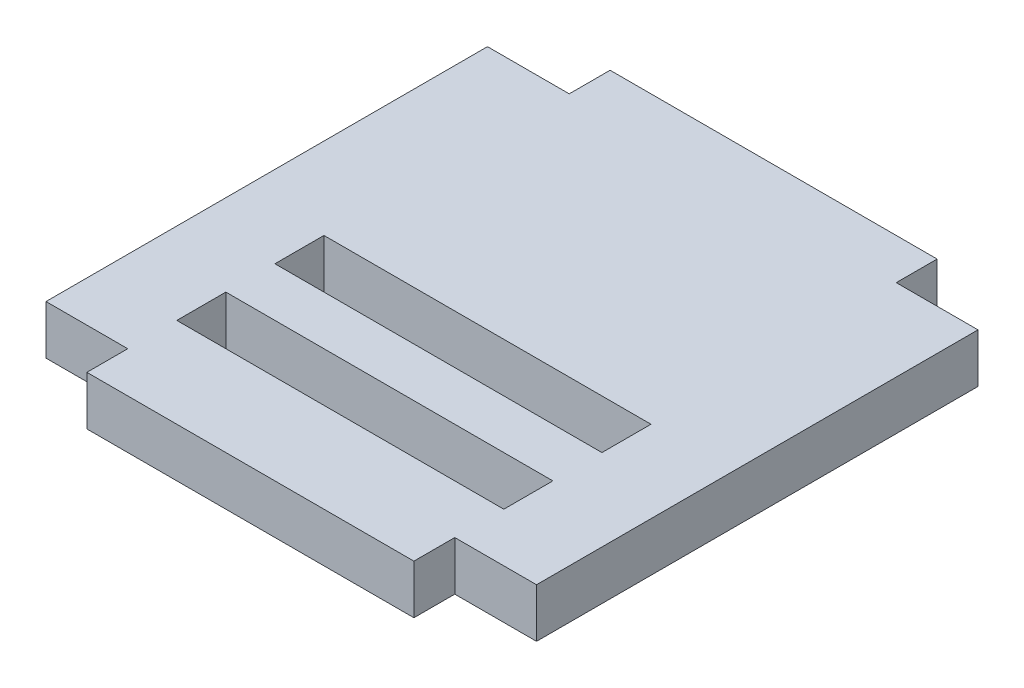
ISO-10303-21;
HEADER;
FILE_DESCRIPTION(('STEP AP214'),'2;1');
FILE_NAME('part.step','',(''),(''),'','','');
FILE_SCHEMA(('AUTOMOTIVE_DESIGN { 1 0 10303 214 1 1 1 1 }'));
ENDSEC;
DATA;
#1=APPLICATION_CONTEXT('core data for automotive mechanical design processes');
#2=APPLICATION_PROTOCOL_DEFINITION('international standard','automotive_design',2000,#1);
#3=PRODUCT_CONTEXT('',#1,'mechanical');
#4=PRODUCT('Part','Part','',(#3));
#5=PRODUCT_RELATED_PRODUCT_CATEGORY('part','',(#4));
#6=PRODUCT_DEFINITION_FORMATION('','',#4);
#7=PRODUCT_DEFINITION_CONTEXT('part definition',#1,'design');
#8=PRODUCT_DEFINITION('design','',#6,#7);
#9=PRODUCT_DEFINITION_SHAPE('','',#8);
#10=(LENGTH_UNIT() NAMED_UNIT(*) SI_UNIT(.MILLI.,.METRE.));
#11=(NAMED_UNIT(*) PLANE_ANGLE_UNIT() SI_UNIT($,.RADIAN.));
#12=(NAMED_UNIT(*) SI_UNIT($,.STERADIAN.) SOLID_ANGLE_UNIT());
#13=UNCERTAINTY_MEASURE_WITH_UNIT(LENGTH_MEASURE(1.E-05),#10,'distance_accuracy_value','');
#14=(GEOMETRIC_REPRESENTATION_CONTEXT(3) GLOBAL_UNCERTAINTY_ASSIGNED_CONTEXT((#13)) GLOBAL_UNIT_ASSIGNED_CONTEXT((#10,
#11,#12)) REPRESENTATION_CONTEXT('',''));
#15=CARTESIAN_POINT('',(0.,0.,0.));
#16=DIRECTION('',(0.,0.,1.));
#17=DIRECTION('',(1.,0.,0.));
#18=AXIS2_PLACEMENT_3D('',#15,#16,#17);
#19=CARTESIAN_POINT('',(-10.,3.,0.));
#20=DIRECTION('',(-1.,0.,0.));
#21=DIRECTION('',(0.,0.,1.));
#22=AXIS2_PLACEMENT_3D('',#19,#20,#21);
#23=PLANE('',#22);
#24=DIRECTION('',(0.,0.,-1.));
#25=VECTOR('',#24,1.);
#26=CARTESIAN_POINT('',(-10.,0.,0.));
#27=LINE('',#26,#25);
#28=CARTESIAN_POINT('',(-10.,0.,-13.5));
#29=VERTEX_POINT('',#28);
#30=CARTESIAN_POINT('',(-10.,0.,-16.));
#31=VERTEX_POINT('',#30);
#32=EDGE_CURVE('E209',#29,#31,#27,.T.);
#33=ORIENTED_EDGE('',*,*,#32,.F.);
#34=DIRECTION('',(0.,-1.,0.));
#35=VECTOR('',#34,1.);
#36=CARTESIAN_POINT('',(-10.,3.,-13.5));
#37=LINE('',#36,#35);
#38=CARTESIAN_POINT('',(-10.,3.,-13.5));
#39=VERTEX_POINT('',#38);
#40=EDGE_CURVE('E11',#39,#29,#37,.T.);
#41=ORIENTED_EDGE('',*,*,#40,.F.);
#42=DIRECTION('',(0.,0.,-1.));
#43=VECTOR('',#42,1.);
#44=CARTESIAN_POINT('',(-10.,3.,0.));
#45=LINE('',#44,#43);
#46=CARTESIAN_POINT('',(-10.,3.,-16.));
#47=VERTEX_POINT('',#46);
#48=EDGE_CURVE('E242',#39,#47,#45,.T.);
#49=ORIENTED_EDGE('',*,*,#48,.T.);
#50=DIRECTION('',(0.,-1.,0.));
#51=VECTOR('',#50,1.);
#52=CARTESIAN_POINT('',(-10.,3.,-16.));
#53=LINE('',#52,#51);
#54=EDGE_CURVE('E270',#47,#31,#53,.T.);
#55=ORIENTED_EDGE('',*,*,#54,.T.);
#56=EDGE_LOOP('',(#33,#41,#49,#55));
#57=FACE_BOUND('',#56,.T.);
#58=ADVANCED_FACE('F37',(#57),#23,.T.);
#59=CARTESIAN_POINT('',(0.,3.,-13.5));
#60=DIRECTION('',(0.,0.,-1.));
#61=DIRECTION('',(-1.,0.,0.));
#62=AXIS2_PLACEMENT_3D('',#59,#60,#61);
#63=PLANE('',#62);
#64=DIRECTION('',(1.,0.,0.));
#65=VECTOR('',#64,1.);
#66=CARTESIAN_POINT('',(0.,0.,-13.5));
#67=LINE('',#66,#65);
#68=CARTESIAN_POINT('',(-15.,0.,-13.5));
#69=VERTEX_POINT('',#68);
#70=EDGE_CURVE('E273',#69,#29,#67,.T.);
#71=ORIENTED_EDGE('',*,*,#70,.F.);
#72=DIRECTION('',(0.,-1.,0.));
#73=VECTOR('',#72,1.);
#74=CARTESIAN_POINT('',(-15.,3.,-13.5));
#75=LINE('',#74,#73);
#76=CARTESIAN_POINT('',(-15.,3.,-13.5));
#77=VERTEX_POINT('',#76);
#78=EDGE_CURVE('E44',#77,#69,#75,.T.);
#79=ORIENTED_EDGE('',*,*,#78,.F.);
#80=DIRECTION('',(1.,0.,0.));
#81=VECTOR('',#80,1.);
#82=CARTESIAN_POINT('',(0.,3.,-13.5));
#83=LINE('',#82,#81);
#84=EDGE_CURVE('E245',#77,#39,#83,.T.);
#85=ORIENTED_EDGE('',*,*,#84,.T.);
#86=ORIENTED_EDGE('',*,*,#40,.T.);
#87=EDGE_LOOP('',(#71,#79,#85,#86));
#88=FACE_BOUND('',#87,.T.);
#89=ADVANCED_FACE('F330',(#88),#63,.T.);
#90=CARTESIAN_POINT('',(-15.,3.,0.));
#91=DIRECTION('',(1.,0.,0.));
#92=DIRECTION('',(0.,0.,-1.));
#93=AXIS2_PLACEMENT_3D('',#90,#91,#92);
#94=PLANE('',#93);
#95=DIRECTION('',(0.,0.,1.));
#96=VECTOR('',#95,1.);
#97=CARTESIAN_POINT('',(-15.,0.,0.));
#98=LINE('',#97,#96);
#99=CARTESIAN_POINT('',(-15.,0.,13.5));
#100=VERTEX_POINT('',#99);
#101=EDGE_CURVE('E276',#69,#100,#98,.T.);
#102=ORIENTED_EDGE('',*,*,#101,.T.);
#103=DIRECTION('',(0.,-1.,0.));
#104=VECTOR('',#103,1.);
#105=CARTESIAN_POINT('',(-15.,3.,13.5));
#106=LINE('',#105,#104);
#107=CARTESIAN_POINT('',(-15.,3.,13.5));
#108=VERTEX_POINT('',#107);
#109=EDGE_CURVE('E317',#108,#100,#106,.T.);
#110=ORIENTED_EDGE('',*,*,#109,.F.);
#111=DIRECTION('',(0.,0.,1.));
#112=VECTOR('',#111,1.);
#113=CARTESIAN_POINT('',(-15.,3.,0.));
#114=LINE('',#113,#112);
#115=EDGE_CURVE('E249',#77,#108,#114,.T.);
#116=ORIENTED_EDGE('',*,*,#115,.F.);
#117=ORIENTED_EDGE('',*,*,#78,.T.);
#118=EDGE_LOOP('',(#102,#110,#116,#117));
#119=FACE_BOUND('',#118,.T.);
#120=ADVANCED_FACE('F322',(#119),#94,.F.);
#121=CARTESIAN_POINT('',(0.,3.,13.5));
#122=DIRECTION('',(0.,0.,-1.));
#123=DIRECTION('',(-1.,0.,0.));
#124=AXIS2_PLACEMENT_3D('',#121,#122,#123);
#125=PLANE('',#124);
#126=DIRECTION('',(1.,0.,0.));
#127=VECTOR('',#126,1.);
#128=CARTESIAN_POINT('',(0.,0.,13.5));
#129=LINE('',#128,#127);
#130=CARTESIAN_POINT('',(-9.99999999999999,0.,13.5));
#131=VERTEX_POINT('',#130);
#132=EDGE_CURVE('E279',#100,#131,#129,.T.);
#133=ORIENTED_EDGE('',*,*,#132,.T.);
#134=DIRECTION('',(0.,-1.,0.));
#135=VECTOR('',#134,1.);
#136=CARTESIAN_POINT('',(-9.99999999999999,3.,13.5));
#137=LINE('',#136,#135);
#138=CARTESIAN_POINT('',(-9.99999999999999,3.,13.5));
#139=VERTEX_POINT('',#138);
#140=EDGE_CURVE('E314',#139,#131,#137,.T.);
#141=ORIENTED_EDGE('',*,*,#140,.F.);
#142=DIRECTION('',(1.,0.,0.));
#143=VECTOR('',#142,1.);
#144=CARTESIAN_POINT('',(0.,3.,13.5));
#145=LINE('',#144,#143);
#146=EDGE_CURVE('E252',#108,#139,#145,.T.);
#147=ORIENTED_EDGE('',*,*,#146,.F.);
#148=ORIENTED_EDGE('',*,*,#109,.T.);
#149=EDGE_LOOP('',(#133,#141,#147,#148));
#150=FACE_BOUND('',#149,.T.);
#151=ADVANCED_FACE('F374',(#150),#125,.F.);
#152=CARTESIAN_POINT('',(-10.,3.,0.));
#153=DIRECTION('',(1.,0.,0.));
#154=DIRECTION('',(0.,0.,-1.));
#155=AXIS2_PLACEMENT_3D('',#152,#153,#154);
#156=PLANE('',#155);
#157=DIRECTION('',(0.,0.,1.));
#158=VECTOR('',#157,1.);
#159=CARTESIAN_POINT('',(-10.,0.,0.));
#160=LINE('',#159,#158);
#161=CARTESIAN_POINT('',(-9.99999999999999,0.,16.));
#162=VERTEX_POINT('',#161);
#163=EDGE_CURVE('E281',#131,#162,#160,.T.);
#164=ORIENTED_EDGE('',*,*,#163,.T.);
#165=DIRECTION('',(0.,-1.,0.));
#166=VECTOR('',#165,1.);
#167=CARTESIAN_POINT('',(-9.99999999999999,3.,16.));
#168=LINE('',#167,#166);
#169=CARTESIAN_POINT('',(-9.99999999999999,3.,16.));
#170=VERTEX_POINT('',#169);
#171=EDGE_CURVE('E311',#170,#162,#168,.T.);
#172=ORIENTED_EDGE('',*,*,#171,.F.);
#173=DIRECTION('',(0.,0.,1.));
#174=VECTOR('',#173,1.);
#175=CARTESIAN_POINT('',(-10.,3.,0.));
#176=LINE('',#175,#174);
#177=EDGE_CURVE('E254',#139,#170,#176,.T.);
#178=ORIENTED_EDGE('',*,*,#177,.F.);
#179=ORIENTED_EDGE('',*,*,#140,.T.);
#180=EDGE_LOOP('',(#164,#172,#178,#179));
#181=FACE_BOUND('',#180,.T.);
#182=ADVANCED_FACE('F369',(#181),#156,.F.);
#183=CARTESIAN_POINT('',(0.,3.,16.));
#184=DIRECTION('',(0.,0.,-1.));
#185=DIRECTION('',(-1.,0.,0.));
#186=AXIS2_PLACEMENT_3D('',#183,#184,#185);
#187=PLANE('',#186);
#188=DIRECTION('',(1.,0.,0.));
#189=VECTOR('',#188,1.);
#190=CARTESIAN_POINT('',(0.,0.,16.));
#191=LINE('',#190,#189);
#192=CARTESIAN_POINT('',(10.,0.,16.));
#193=VERTEX_POINT('',#192);
#194=EDGE_CURVE('E284',#162,#193,#191,.T.);
#195=ORIENTED_EDGE('',*,*,#194,.T.);
#196=DIRECTION('',(0.,-1.,0.));
#197=VECTOR('',#196,1.);
#198=CARTESIAN_POINT('',(10.,3.,16.));
#199=LINE('',#198,#197);
#200=CARTESIAN_POINT('',(10.,3.,16.));
#201=VERTEX_POINT('',#200);
#202=EDGE_CURVE('E309',#201,#193,#199,.T.);
#203=ORIENTED_EDGE('',*,*,#202,.F.);
#204=DIRECTION('',(1.,0.,0.));
#205=VECTOR('',#204,1.);
#206=CARTESIAN_POINT('',(0.,3.,16.));
#207=LINE('',#206,#205);
#208=EDGE_CURVE('E257',#170,#201,#207,.T.);
#209=ORIENTED_EDGE('',*,*,#208,.F.);
#210=ORIENTED_EDGE('',*,*,#171,.T.);
#211=EDGE_LOOP('',(#195,#203,#209,#210));
#212=FACE_BOUND('',#211,.T.);
#213=ADVANCED_FACE('F366',(#212),#187,.F.);
#214=CARTESIAN_POINT('',(10.,3.,0.));
#215=DIRECTION('',(1.,0.,0.));
#216=DIRECTION('',(0.,0.,-1.));
#217=AXIS2_PLACEMENT_3D('',#214,#215,#216);
#218=PLANE('',#217);
#219=DIRECTION('',(0.,0.,1.));
#220=VECTOR('',#219,1.);
#221=CARTESIAN_POINT('',(10.,0.,0.));
#222=LINE('',#221,#220);
#223=CARTESIAN_POINT('',(10.,0.,13.5));
#224=VERTEX_POINT('',#223);
#225=EDGE_CURVE('E287',#224,#193,#222,.T.);
#226=ORIENTED_EDGE('',*,*,#225,.F.);
#227=DIRECTION('',(0.,-1.,0.));
#228=VECTOR('',#227,1.);
#229=CARTESIAN_POINT('',(10.,3.,13.5));
#230=LINE('',#229,#228);
#231=CARTESIAN_POINT('',(10.,3.,13.5));
#232=VERTEX_POINT('',#231);
#233=EDGE_CURVE('E307',#232,#224,#230,.T.);
#234=ORIENTED_EDGE('',*,*,#233,.F.);
#235=DIRECTION('',(0.,0.,1.));
#236=VECTOR('',#235,1.);
#237=CARTESIAN_POINT('',(10.,3.,0.));
#238=LINE('',#237,#236);
#239=EDGE_CURVE('E259',#232,#201,#238,.T.);
#240=ORIENTED_EDGE('',*,*,#239,.T.);
#241=ORIENTED_EDGE('',*,*,#202,.T.);
#242=EDGE_LOOP('',(#226,#234,#240,#241));
#243=FACE_BOUND('',#242,.T.);
#244=ADVANCED_FACE('F360',(#243),#218,.T.);
#245=CARTESIAN_POINT('',(15.,0.,13.5));
#246=VERTEX_POINT('',#245);
#247=EDGE_CURVE('E282',#224,#246,#129,.T.);
#248=ORIENTED_EDGE('',*,*,#247,.T.);
#249=DIRECTION('',(0.,-1.,0.));
#250=VECTOR('',#249,1.);
#251=CARTESIAN_POINT('',(15.,3.,13.5));
#252=LINE('',#251,#250);
#253=CARTESIAN_POINT('',(15.,3.,13.5));
#254=VERTEX_POINT('',#253);
#255=EDGE_CURVE('E305',#254,#246,#252,.T.);
#256=ORIENTED_EDGE('',*,*,#255,.F.);
#257=EDGE_CURVE('E255',#232,#254,#145,.T.);
#258=ORIENTED_EDGE('',*,*,#257,.F.);
#259=ORIENTED_EDGE('',*,*,#233,.T.);
#260=EDGE_LOOP('',(#248,#256,#258,#259));
#261=FACE_BOUND('',#260,.T.);
#262=ADVANCED_FACE('F377',(#261),#125,.F.);
#263=CARTESIAN_POINT('',(15.,3.,0.));
#264=DIRECTION('',(1.,0.,0.));
#265=DIRECTION('',(0.,0.,-1.));
#266=AXIS2_PLACEMENT_3D('',#263,#264,#265);
#267=PLANE('',#266);
#268=DIRECTION('',(0.,0.,1.));
#269=VECTOR('',#268,1.);
#270=CARTESIAN_POINT('',(15.,0.,0.));
#271=LINE('',#270,#269);
#272=CARTESIAN_POINT('',(15.,0.,-13.5));
#273=VERTEX_POINT('',#272);
#274=EDGE_CURVE('E290',#273,#246,#271,.T.);
#275=ORIENTED_EDGE('',*,*,#274,.F.);
#276=DIRECTION('',(0.,-1.,0.));
#277=VECTOR('',#276,1.);
#278=CARTESIAN_POINT('',(15.,3.,-13.5));
#279=LINE('',#278,#277);
#280=CARTESIAN_POINT('',(15.,3.,-13.5));
#281=VERTEX_POINT('',#280);
#282=EDGE_CURVE('E303',#281,#273,#279,.T.);
#283=ORIENTED_EDGE('',*,*,#282,.F.);
#284=DIRECTION('',(0.,0.,1.));
#285=VECTOR('',#284,1.);
#286=CARTESIAN_POINT('',(15.,3.,0.));
#287=LINE('',#286,#285);
#288=EDGE_CURVE('E262',#281,#254,#287,.T.);
#289=ORIENTED_EDGE('',*,*,#288,.T.);
#290=ORIENTED_EDGE('',*,*,#255,.T.);
#291=EDGE_LOOP('',(#275,#283,#289,#290));
#292=FACE_BOUND('',#291,.T.);
#293=ADVANCED_FACE('F352',(#292),#267,.T.);
#294=CARTESIAN_POINT('',(10.,0.,-13.5));
#295=VERTEX_POINT('',#294);
#296=EDGE_CURVE('E277',#295,#273,#67,.T.);
#297=ORIENTED_EDGE('',*,*,#296,.F.);
#298=DIRECTION('',(0.,-1.,0.));
#299=VECTOR('',#298,1.);
#300=CARTESIAN_POINT('',(10.,3.,-13.5));
#301=LINE('',#300,#299);
#302=CARTESIAN_POINT('',(10.,3.,-13.5));
#303=VERTEX_POINT('',#302);
#304=EDGE_CURVE('E301',#303,#295,#301,.T.);
#305=ORIENTED_EDGE('',*,*,#304,.F.);
#306=EDGE_CURVE('E250',#303,#281,#83,.T.);
#307=ORIENTED_EDGE('',*,*,#306,.T.);
#308=ORIENTED_EDGE('',*,*,#282,.T.);
#309=EDGE_LOOP('',(#297,#305,#307,#308));
#310=FACE_BOUND('',#309,.T.);
#311=ADVANCED_FACE('F346',(#310),#63,.T.);
#312=CARTESIAN_POINT('',(10.,3.,0.));
#313=DIRECTION('',(-1.,0.,0.));
#314=DIRECTION('',(0.,0.,1.));
#315=AXIS2_PLACEMENT_3D('',#312,#313,#314);
#316=PLANE('',#315);
#317=DIRECTION('',(0.,0.,-1.));
#318=VECTOR('',#317,1.);
#319=CARTESIAN_POINT('',(10.,0.,0.));
#320=LINE('',#319,#318);
#321=CARTESIAN_POINT('',(10.,0.,-16.));
#322=VERTEX_POINT('',#321);
#323=EDGE_CURVE('E293',#295,#322,#320,.T.);
#324=ORIENTED_EDGE('',*,*,#323,.T.);
#325=DIRECTION('',(0.,-1.,0.));
#326=VECTOR('',#325,1.);
#327=CARTESIAN_POINT('',(10.,3.,-16.));
#328=LINE('',#327,#326);
#329=CARTESIAN_POINT('',(10.,3.,-16.));
#330=VERTEX_POINT('',#329);
#331=EDGE_CURVE('E299',#330,#322,#328,.T.);
#332=ORIENTED_EDGE('',*,*,#331,.F.);
#333=DIRECTION('',(0.,0.,-1.));
#334=VECTOR('',#333,1.);
#335=CARTESIAN_POINT('',(10.,3.,0.));
#336=LINE('',#335,#334);
#337=EDGE_CURVE('E265',#303,#330,#336,.T.);
#338=ORIENTED_EDGE('',*,*,#337,.F.);
#339=ORIENTED_EDGE('',*,*,#304,.T.);
#340=EDGE_LOOP('',(#324,#332,#338,#339));
#341=FACE_BOUND('',#340,.T.);
#342=ADVANCED_FACE('F342',(#341),#316,.F.);
#343=CARTESIAN_POINT('',(0.,3.,-16.));
#344=DIRECTION('',(0.,0.,-1.));
#345=DIRECTION('',(-1.,0.,0.));
#346=AXIS2_PLACEMENT_3D('',#343,#344,#345);
#347=PLANE('',#346);
#348=DIRECTION('',(1.,0.,0.));
#349=VECTOR('',#348,1.);
#350=CARTESIAN_POINT('',(0.,0.,-16.));
#351=LINE('',#350,#349);
#352=EDGE_CURVE('E246',#31,#322,#351,.T.);
#353=ORIENTED_EDGE('',*,*,#352,.F.);
#354=ORIENTED_EDGE('',*,*,#54,.F.);
#355=DIRECTION('',(1.,0.,0.));
#356=VECTOR('',#355,1.);
#357=CARTESIAN_POINT('',(0.,3.,-16.));
#358=LINE('',#357,#356);
#359=EDGE_CURVE('E267',#47,#330,#358,.T.);
#360=ORIENTED_EDGE('',*,*,#359,.T.);
#361=ORIENTED_EDGE('',*,*,#331,.T.);
#362=EDGE_LOOP('',(#353,#354,#360,#361));
#363=FACE_BOUND('',#362,.T.);
#364=ADVANCED_FACE('F337',(#363),#347,.T.);
#365=CARTESIAN_POINT('',(0.,3.,0.));
#366=DIRECTION('',(0.,1.,0.));
#367=DIRECTION('',(0.,0.,1.));
#368=AXIS2_PLACEMENT_3D('',#365,#366,#367);
#369=PLANE('',#368);
#370=DIRECTION('',(0.,0.,1.));
#371=VECTOR('',#370,1.);
#372=CARTESIAN_POINT('',(-10.,3.,7.5));
#373=LINE('',#372,#371);
#374=CARTESIAN_POINT('',(-10.,3.,7.5));
#375=VERTEX_POINT('',#374);
#376=CARTESIAN_POINT('',(-10.,3.,10.5));
#377=VERTEX_POINT('',#376);
#378=EDGE_CURVE('E51',#375,#377,#373,.T.);
#379=ORIENTED_EDGE('',*,*,#378,.F.);
#380=DIRECTION('',(-1.,0.,0.));
#381=VECTOR('',#380,1.);
#382=CARTESIAN_POINT('',(-10.,3.,7.5));
#383=LINE('',#382,#381);
#384=CARTESIAN_POINT('',(10.,3.,7.5));
#385=VERTEX_POINT('',#384);
#386=EDGE_CURVE('E193',#385,#375,#383,.T.);
#387=ORIENTED_EDGE('',*,*,#386,.F.);
#388=DIRECTION('',(0.,0.,-1.));
#389=VECTOR('',#388,1.);
#390=CARTESIAN_POINT('',(10.,3.,7.5));
#391=LINE('',#390,#389);
#392=CARTESIAN_POINT('',(10.,3.,10.5));
#393=VERTEX_POINT('',#392);
#394=EDGE_CURVE('E196',#393,#385,#391,.T.);
#395=ORIENTED_EDGE('',*,*,#394,.F.);
#396=DIRECTION('',(1.,0.,0.));
#397=VECTOR('',#396,1.);
#398=CARTESIAN_POINT('',(-10.,3.,10.5));
#399=LINE('',#398,#397);
#400=EDGE_CURVE('E202',#377,#393,#399,.T.);
#401=ORIENTED_EDGE('',*,*,#400,.F.);
#402=EDGE_LOOP('',(#379,#387,#395,#401));
#403=FACE_BOUND('',#402,.T.);
#404=DIRECTION('',(0.,0.,1.));
#405=VECTOR('',#404,1.);
#406=CARTESIAN_POINT('',(-10.,3.,4.5));
#407=LINE('',#406,#405);
#408=CARTESIAN_POINT('',(-10.,3.,1.5));
#409=VERTEX_POINT('',#408);
#410=CARTESIAN_POINT('',(-10.,3.,4.5));
#411=VERTEX_POINT('',#410);
#412=EDGE_CURVE('E59',#409,#411,#407,.T.);
#413=ORIENTED_EDGE('',*,*,#412,.F.);
#414=DIRECTION('',(-1.,0.,0.));
#415=VECTOR('',#414,1.);
#416=CARTESIAN_POINT('',(-10.,3.,1.5));
#417=LINE('',#416,#415);
#418=CARTESIAN_POINT('',(10.,3.,1.5));
#419=VERTEX_POINT('',#418);
#420=EDGE_CURVE('E217',#419,#409,#417,.T.);
#421=ORIENTED_EDGE('',*,*,#420,.F.);
#422=DIRECTION('',(0.,0.,-1.));
#423=VECTOR('',#422,1.);
#424=CARTESIAN_POINT('',(10.,3.,4.5));
#425=LINE('',#424,#423);
#426=CARTESIAN_POINT('',(10.,3.,4.5));
#427=VERTEX_POINT('',#426);
#428=EDGE_CURVE('E231',#427,#419,#425,.T.);
#429=ORIENTED_EDGE('',*,*,#428,.F.);
#430=DIRECTION('',(1.,0.,0.));
#431=VECTOR('',#430,1.);
#432=CARTESIAN_POINT('',(-10.,3.,4.5));
#433=LINE('',#432,#431);
#434=EDGE_CURVE('E228',#411,#427,#433,.T.);
#435=ORIENTED_EDGE('',*,*,#434,.F.);
#436=EDGE_LOOP('',(#413,#421,#429,#435));
#437=FACE_BOUND('',#436,.T.);
#438=ORIENTED_EDGE('',*,*,#48,.F.);
#439=ORIENTED_EDGE('',*,*,#84,.F.);
#440=ORIENTED_EDGE('',*,*,#115,.T.);
#441=ORIENTED_EDGE('',*,*,#146,.T.);
#442=ORIENTED_EDGE('',*,*,#177,.T.);
#443=ORIENTED_EDGE('',*,*,#208,.T.);
#444=ORIENTED_EDGE('',*,*,#239,.F.);
#445=ORIENTED_EDGE('',*,*,#257,.T.);
#446=ORIENTED_EDGE('',*,*,#288,.F.);
#447=ORIENTED_EDGE('',*,*,#306,.F.);
#448=ORIENTED_EDGE('',*,*,#337,.T.);
#449=ORIENTED_EDGE('',*,*,#359,.F.);
#450=EDGE_LOOP('',(#438,#439,#440,#441,#442,#443,#444,#445,#446,#447,#448,#449));
#451=FACE_BOUND('',#450,.T.);
#452=ADVANCED_FACE('F376',(#403,#437,#451),#369,.T.);
#453=CARTESIAN_POINT('',(0.,0.,0.));
#454=DIRECTION('',(0.,1.,0.));
#455=DIRECTION('',(0.,0.,1.));
#456=AXIS2_PLACEMENT_3D('',#453,#454,#455);
#457=PLANE('',#456);
#458=DIRECTION('',(-1.,0.,0.));
#459=VECTOR('',#458,1.);
#460=CARTESIAN_POINT('',(-10.,0.,7.5));
#461=LINE('',#460,#459);
#462=CARTESIAN_POINT('',(10.,0.,7.5));
#463=VERTEX_POINT('',#462);
#464=CARTESIAN_POINT('',(-10.,0.,7.5));
#465=VERTEX_POINT('',#464);
#466=EDGE_CURVE('E180',#463,#465,#461,.T.);
#467=ORIENTED_EDGE('',*,*,#466,.T.);
#468=DIRECTION('',(0.,0.,1.));
#469=VECTOR('',#468,1.);
#470=CARTESIAN_POINT('',(-10.,0.,7.5));
#471=LINE('',#470,#469);
#472=CARTESIAN_POINT('',(-10.,0.,10.5));
#473=VERTEX_POINT('',#472);
#474=EDGE_CURVE('E174',#465,#473,#471,.T.);
#475=ORIENTED_EDGE('',*,*,#474,.T.);
#476=DIRECTION('',(1.,0.,0.));
#477=VECTOR('',#476,1.);
#478=CARTESIAN_POINT('',(-10.,0.,10.5));
#479=LINE('',#478,#477);
#480=CARTESIAN_POINT('',(10.,0.,10.5));
#481=VERTEX_POINT('',#480);
#482=EDGE_CURVE('E184',#473,#481,#479,.T.);
#483=ORIENTED_EDGE('',*,*,#482,.T.);
#484=DIRECTION('',(0.,0.,-1.));
#485=VECTOR('',#484,1.);
#486=CARTESIAN_POINT('',(10.,0.,7.5));
#487=LINE('',#486,#485);
#488=EDGE_CURVE('E188',#481,#463,#487,.T.);
#489=ORIENTED_EDGE('',*,*,#488,.T.);
#490=EDGE_LOOP('',(#467,#475,#483,#489));
#491=FACE_BOUND('',#490,.T.);
#492=DIRECTION('',(-1.,0.,0.));
#493=VECTOR('',#492,1.);
#494=CARTESIAN_POINT('',(-10.,0.,1.5));
#495=LINE('',#494,#493);
#496=CARTESIAN_POINT('',(10.,0.,1.5));
#497=VERTEX_POINT('',#496);
#498=CARTESIAN_POINT('',(-10.,0.,1.5));
#499=VERTEX_POINT('',#498);
#500=EDGE_CURVE('E223',#497,#499,#495,.T.);
#501=ORIENTED_EDGE('',*,*,#500,.T.);
#502=DIRECTION('',(0.,0.,1.));
#503=VECTOR('',#502,1.);
#504=CARTESIAN_POINT('',(-10.,0.,4.5));
#505=LINE('',#504,#503);
#506=CARTESIAN_POINT('',(-10.,0.,4.5));
#507=VERTEX_POINT('',#506);
#508=EDGE_CURVE('E213',#499,#507,#505,.T.);
#509=ORIENTED_EDGE('',*,*,#508,.T.);
#510=DIRECTION('',(1.,0.,0.));
#511=VECTOR('',#510,1.);
#512=CARTESIAN_POINT('',(-10.,0.,4.5));
#513=LINE('',#512,#511);
#514=CARTESIAN_POINT('',(10.,0.,4.5));
#515=VERTEX_POINT('',#514);
#516=EDGE_CURVE('E216',#507,#515,#513,.T.);
#517=ORIENTED_EDGE('',*,*,#516,.T.);
#518=DIRECTION('',(0.,0.,-1.));
#519=VECTOR('',#518,1.);
#520=CARTESIAN_POINT('',(10.,0.,4.5));
#521=LINE('',#520,#519);
#522=EDGE_CURVE('E220',#515,#497,#521,.T.);
#523=ORIENTED_EDGE('',*,*,#522,.T.);
#524=EDGE_LOOP('',(#501,#509,#517,#523));
#525=FACE_BOUND('',#524,.T.);
#526=ORIENTED_EDGE('',*,*,#32,.T.);
#527=ORIENTED_EDGE('',*,*,#352,.T.);
#528=ORIENTED_EDGE('',*,*,#323,.F.);
#529=ORIENTED_EDGE('',*,*,#296,.T.);
#530=ORIENTED_EDGE('',*,*,#274,.T.);
#531=ORIENTED_EDGE('',*,*,#247,.F.);
#532=ORIENTED_EDGE('',*,*,#225,.T.);
#533=ORIENTED_EDGE('',*,*,#194,.F.);
#534=ORIENTED_EDGE('',*,*,#163,.F.);
#535=ORIENTED_EDGE('',*,*,#132,.F.);
#536=ORIENTED_EDGE('',*,*,#101,.F.);
#537=ORIENTED_EDGE('',*,*,#70,.T.);
#538=EDGE_LOOP('',(#526,#527,#528,#529,#530,#531,#532,#533,#534,#535,#536,#537));
#539=FACE_BOUND('',#538,.T.);
#540=ADVANCED_FACE('F190',(#491,#525,#539),#457,.F.);
#541=CARTESIAN_POINT('',(-10.,0.,4.5));
#542=DIRECTION('',(-1.,0.,0.));
#543=DIRECTION('',(0.,0.,1.));
#544=AXIS2_PLACEMENT_3D('',#541,#542,#543);
#545=PLANE('',#544);
#546=ORIENTED_EDGE('',*,*,#412,.T.);
#547=DIRECTION('',(0.,1.,0.));
#548=VECTOR('',#547,1.);
#549=CARTESIAN_POINT('',(-10.,0.,4.5));
#550=LINE('',#549,#548);
#551=EDGE_CURVE('E226',#507,#411,#550,.T.);
#552=ORIENTED_EDGE('',*,*,#551,.F.);
#553=ORIENTED_EDGE('',*,*,#508,.F.);
#554=DIRECTION('',(0.,1.,0.));
#555=VECTOR('',#554,1.);
#556=CARTESIAN_POINT('',(-10.,0.,1.5));
#557=LINE('',#556,#555);
#558=EDGE_CURVE('E203',#499,#409,#557,.T.);
#559=ORIENTED_EDGE('',*,*,#558,.T.);
#560=EDGE_LOOP('',(#546,#552,#553,#559));
#561=FACE_BOUND('',#560,.T.);
#562=ADVANCED_FACE('F407',(#561),#545,.F.);
#563=CARTESIAN_POINT('',(-10.,0.,1.5));
#564=DIRECTION('',(0.,0.,-1.));
#565=DIRECTION('',(-1.,0.,0.));
#566=AXIS2_PLACEMENT_3D('',#563,#564,#565);
#567=PLANE('',#566);
#568=ORIENTED_EDGE('',*,*,#420,.T.);
#569=ORIENTED_EDGE('',*,*,#558,.F.);
#570=ORIENTED_EDGE('',*,*,#500,.F.);
#571=DIRECTION('',(0.,1.,0.));
#572=VECTOR('',#571,1.);
#573=CARTESIAN_POINT('',(10.,0.,1.5));
#574=LINE('',#573,#572);
#575=EDGE_CURVE('E237',#497,#419,#574,.T.);
#576=ORIENTED_EDGE('',*,*,#575,.T.);
#577=EDGE_LOOP('',(#568,#569,#570,#576));
#578=FACE_BOUND('',#577,.T.);
#579=ADVANCED_FACE('F413',(#578),#567,.F.);
#580=CARTESIAN_POINT('',(10.,0.,4.5));
#581=DIRECTION('',(1.,0.,0.));
#582=DIRECTION('',(0.,0.,-1.));
#583=AXIS2_PLACEMENT_3D('',#580,#581,#582);
#584=PLANE('',#583);
#585=ORIENTED_EDGE('',*,*,#428,.T.);
#586=ORIENTED_EDGE('',*,*,#575,.F.);
#587=ORIENTED_EDGE('',*,*,#522,.F.);
#588=DIRECTION('',(0.,1.,0.));
#589=VECTOR('',#588,1.);
#590=CARTESIAN_POINT('',(10.,0.,4.5));
#591=LINE('',#590,#589);
#592=EDGE_CURVE('E239',#515,#427,#591,.T.);
#593=ORIENTED_EDGE('',*,*,#592,.T.);
#594=EDGE_LOOP('',(#585,#586,#587,#593));
#595=FACE_BOUND('',#594,.T.);
#596=ADVANCED_FACE('F417',(#595),#584,.F.);
#597=CARTESIAN_POINT('',(-10.,0.,4.5));
#598=DIRECTION('',(0.,0.,1.));
#599=DIRECTION('',(1.,0.,0.));
#600=AXIS2_PLACEMENT_3D('',#597,#598,#599);
#601=PLANE('',#600);
#602=ORIENTED_EDGE('',*,*,#434,.T.);
#603=ORIENTED_EDGE('',*,*,#592,.F.);
#604=ORIENTED_EDGE('',*,*,#516,.F.);
#605=ORIENTED_EDGE('',*,*,#551,.T.);
#606=EDGE_LOOP('',(#602,#603,#604,#605));
#607=FACE_BOUND('',#606,.T.);
#608=ADVANCED_FACE('F414',(#607),#601,.F.);
#609=CARTESIAN_POINT('',(-10.,0.,7.5));
#610=DIRECTION('',(-1.,0.,0.));
#611=DIRECTION('',(0.,0.,1.));
#612=AXIS2_PLACEMENT_3D('',#609,#610,#611);
#613=PLANE('',#612);
#614=ORIENTED_EDGE('',*,*,#378,.T.);
#615=DIRECTION('',(0.,1.,0.));
#616=VECTOR('',#615,1.);
#617=CARTESIAN_POINT('',(-10.,0.,10.5));
#618=LINE('',#617,#616);
#619=EDGE_CURVE('E170',#473,#377,#618,.T.);
#620=ORIENTED_EDGE('',*,*,#619,.F.);
#621=ORIENTED_EDGE('',*,*,#474,.F.);
#622=DIRECTION('',(0.,1.,0.));
#623=VECTOR('',#622,1.);
#624=CARTESIAN_POINT('',(-10.,0.,7.5));
#625=LINE('',#624,#623);
#626=EDGE_CURVE('E207',#465,#375,#625,.T.);
#627=ORIENTED_EDGE('',*,*,#626,.T.);
#628=EDGE_LOOP('',(#614,#620,#621,#627));
#629=FACE_BOUND('',#628,.T.);
#630=ADVANCED_FACE('F172',(#629),#613,.F.);
#631=CARTESIAN_POINT('',(-10.,0.,7.5));
#632=DIRECTION('',(0.,0.,-1.));
#633=DIRECTION('',(-1.,0.,0.));
#634=AXIS2_PLACEMENT_3D('',#631,#632,#633);
#635=PLANE('',#634);
#636=ORIENTED_EDGE('',*,*,#386,.T.);
#637=ORIENTED_EDGE('',*,*,#626,.F.);
#638=ORIENTED_EDGE('',*,*,#466,.F.);
#639=DIRECTION('',(0.,1.,0.));
#640=VECTOR('',#639,1.);
#641=CARTESIAN_POINT('',(10.,0.,7.5));
#642=LINE('',#641,#640);
#643=EDGE_CURVE('E210',#463,#385,#642,.T.);
#644=ORIENTED_EDGE('',*,*,#643,.T.);
#645=EDGE_LOOP('',(#636,#637,#638,#644));
#646=FACE_BOUND('',#645,.T.);
#647=ADVANCED_FACE('F427',(#646),#635,.F.);
#648=CARTESIAN_POINT('',(10.,0.,7.5));
#649=DIRECTION('',(1.,0.,0.));
#650=DIRECTION('',(0.,0.,-1.));
#651=AXIS2_PLACEMENT_3D('',#648,#649,#650);
#652=PLANE('',#651);
#653=ORIENTED_EDGE('',*,*,#394,.T.);
#654=ORIENTED_EDGE('',*,*,#643,.F.);
#655=ORIENTED_EDGE('',*,*,#488,.F.);
#656=DIRECTION('',(0.,1.,0.));
#657=VECTOR('',#656,1.);
#658=CARTESIAN_POINT('',(10.,0.,10.5));
#659=LINE('',#658,#657);
#660=EDGE_CURVE('E179',#481,#393,#659,.T.);
#661=ORIENTED_EDGE('',*,*,#660,.T.);
#662=EDGE_LOOP('',(#653,#654,#655,#661));
#663=FACE_BOUND('',#662,.T.);
#664=ADVANCED_FACE('F430',(#663),#652,.F.);
#665=CARTESIAN_POINT('',(-10.,0.,10.5));
#666=DIRECTION('',(0.,0.,1.));
#667=DIRECTION('',(1.,0.,0.));
#668=AXIS2_PLACEMENT_3D('',#665,#666,#667);
#669=PLANE('',#668);
#670=ORIENTED_EDGE('',*,*,#400,.T.);
#671=ORIENTED_EDGE('',*,*,#660,.F.);
#672=ORIENTED_EDGE('',*,*,#482,.F.);
#673=ORIENTED_EDGE('',*,*,#619,.T.);
#674=EDGE_LOOP('',(#670,#671,#672,#673));
#675=FACE_BOUND('',#674,.T.);
#676=ADVANCED_FACE('F185',(#675),#669,.F.);
#677=CLOSED_SHELL('',(#58,#89,#120,#151,#182,#213,#244,#262,#293,#311,#342,#364,#452,#540,#562,
#579,#596,#608,#630,#647,#664,#676));
#678=MANIFOLD_SOLID_BREP('B2',#677);
#679=ADVANCED_BREP_SHAPE_REPRESENTATION('',(#18,#678),#14);
#680=SHAPE_DEFINITION_REPRESENTATION(#9,#679);
ENDSEC;
END-ISO-10303-21;
